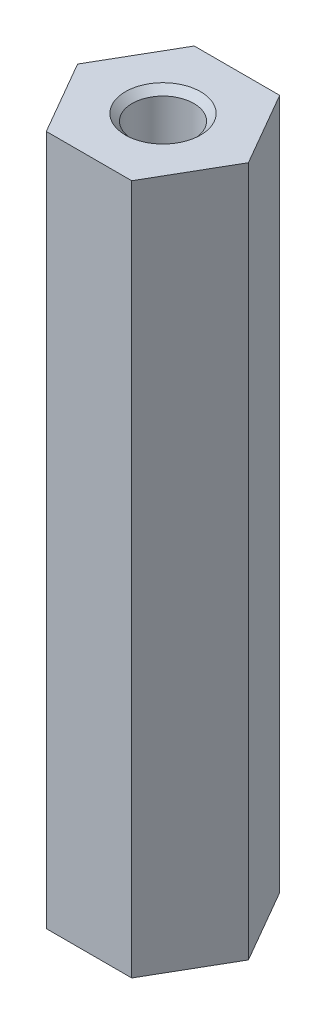
ISO-10303-21;
HEADER;
FILE_DESCRIPTION(('STEP AP214'),'2;1');
FILE_NAME('part.step','',(''),(''),'','','');
FILE_SCHEMA(('AUTOMOTIVE_DESIGN { 1 0 10303 214 1 1 1 1 }'));
ENDSEC;
DATA;
#1=APPLICATION_CONTEXT('core data for automotive mechanical design processes');
#2=APPLICATION_PROTOCOL_DEFINITION('international standard','automotive_design',2000,#1);
#3=PRODUCT_CONTEXT('',#1,'mechanical');
#4=PRODUCT('Part','Part','',(#3));
#5=PRODUCT_RELATED_PRODUCT_CATEGORY('part','',(#4));
#6=PRODUCT_DEFINITION_FORMATION('','',#4);
#7=PRODUCT_DEFINITION_CONTEXT('part definition',#1,'design');
#8=PRODUCT_DEFINITION('design','',#6,#7);
#9=PRODUCT_DEFINITION_SHAPE('','',#8);
#10=(LENGTH_UNIT() NAMED_UNIT(*) SI_UNIT(.MILLI.,.METRE.));
#11=(NAMED_UNIT(*) PLANE_ANGLE_UNIT() SI_UNIT($,.RADIAN.));
#12=(NAMED_UNIT(*) SI_UNIT($,.STERADIAN.) SOLID_ANGLE_UNIT());
#13=UNCERTAINTY_MEASURE_WITH_UNIT(LENGTH_MEASURE(1.E-05),#10,'distance_accuracy_value','');
#14=(GEOMETRIC_REPRESENTATION_CONTEXT(3) GLOBAL_UNCERTAINTY_ASSIGNED_CONTEXT((#13)) GLOBAL_UNIT_ASSIGNED_CONTEXT((#10,
#11,#12)) REPRESENTATION_CONTEXT('',''));
#15=CARTESIAN_POINT('',(0.,0.,0.));
#16=DIRECTION('',(0.,0.,1.));
#17=DIRECTION('',(1.,0.,0.));
#18=AXIS2_PLACEMENT_3D('',#15,#16,#17);
#19=CARTESIAN_POINT('',(1.73205080756888,28.,3.));
#20=DIRECTION('',(-0.866025403784439,0.,-0.5));
#21=DIRECTION('',(-0.5,0.,0.866025403784439));
#22=AXIS2_PLACEMENT_3D('',#19,#20,#21);
#23=PLANE('',#22);
#24=DIRECTION('',(0.5,0.,-0.866025403784439));
#25=VECTOR('',#24,1.);
#26=CARTESIAN_POINT('',(1.73205080756888,0.,3.));
#27=LINE('',#26,#25);
#28=CARTESIAN_POINT('',(1.73205080756888,0.,3.));
#29=VERTEX_POINT('',#28);
#30=CARTESIAN_POINT('',(3.46410161513775,0.,0.));
#31=VERTEX_POINT('',#30);
#32=EDGE_CURVE('E125',#29,#31,#27,.T.);
#33=ORIENTED_EDGE('',*,*,#32,.T.);
#34=DIRECTION('',(0.,-1.,0.));
#35=VECTOR('',#34,1.);
#36=CARTESIAN_POINT('',(3.46410161513775,28.,0.));
#37=LINE('',#36,#35);
#38=CARTESIAN_POINT('',(3.46410161513775,28.,0.));
#39=VERTEX_POINT('',#38);
#40=EDGE_CURVE('E11',#39,#31,#37,.T.);
#41=ORIENTED_EDGE('',*,*,#40,.F.);
#42=DIRECTION('',(0.5,0.,-0.866025403784439));
#43=VECTOR('',#42,1.);
#44=CARTESIAN_POINT('',(1.73205080756888,28.,3.));
#45=LINE('',#44,#43);
#46=CARTESIAN_POINT('',(1.73205080756888,28.,3.));
#47=VERTEX_POINT('',#46);
#48=EDGE_CURVE('E136',#47,#39,#45,.T.);
#49=ORIENTED_EDGE('',*,*,#48,.F.);
#50=DIRECTION('',(0.,-1.,0.));
#51=VECTOR('',#50,1.);
#52=CARTESIAN_POINT('',(1.73205080756888,28.,3.));
#53=LINE('',#52,#51);
#54=EDGE_CURVE('E121',#47,#29,#53,.T.);
#55=ORIENTED_EDGE('',*,*,#54,.T.);
#56=EDGE_LOOP('',(#33,#41,#49,#55));
#57=FACE_BOUND('',#56,.T.);
#58=ADVANCED_FACE('F41',(#57),#23,.F.);
#59=CARTESIAN_POINT('',(3.46410161513775,28.,0.));
#60=DIRECTION('',(-0.866025403784439,0.,0.5));
#61=DIRECTION('',(0.5,0.,0.866025403784439));
#62=AXIS2_PLACEMENT_3D('',#59,#60,#61);
#63=PLANE('',#62);
#64=DIRECTION('',(-0.5,0.,-0.866025403784439));
#65=VECTOR('',#64,1.);
#66=CARTESIAN_POINT('',(3.46410161513775,0.,0.));
#67=LINE('',#66,#65);
#68=CARTESIAN_POINT('',(1.73205080756888,0.,-3.));
#69=VERTEX_POINT('',#68);
#70=EDGE_CURVE('E128',#31,#69,#67,.T.);
#71=ORIENTED_EDGE('',*,*,#70,.T.);
#72=DIRECTION('',(0.,-1.,0.));
#73=VECTOR('',#72,1.);
#74=CARTESIAN_POINT('',(1.73205080756888,28.,-3.));
#75=LINE('',#74,#73);
#76=CARTESIAN_POINT('',(1.73205080756888,28.,-3.));
#77=VERTEX_POINT('',#76);
#78=EDGE_CURVE('E49',#77,#69,#75,.T.);
#79=ORIENTED_EDGE('',*,*,#78,.F.);
#80=DIRECTION('',(-0.5,0.,-0.866025403784439));
#81=VECTOR('',#80,1.);
#82=CARTESIAN_POINT('',(3.46410161513775,28.,0.));
#83=LINE('',#82,#81);
#84=EDGE_CURVE('E94',#39,#77,#83,.T.);
#85=ORIENTED_EDGE('',*,*,#84,.F.);
#86=ORIENTED_EDGE('',*,*,#40,.T.);
#87=EDGE_LOOP('',(#71,#79,#85,#86));
#88=FACE_BOUND('',#87,.T.);
#89=ADVANCED_FACE('F161',(#88),#63,.F.);
#90=CARTESIAN_POINT('',(1.73205080756888,28.,-3.));
#91=DIRECTION('',(0.,0.,1.));
#92=DIRECTION('',(1.,0.,0.));
#93=AXIS2_PLACEMENT_3D('',#90,#91,#92);
#94=PLANE('',#93);
#95=DIRECTION('',(-1.,0.,0.));
#96=VECTOR('',#95,1.);
#97=CARTESIAN_POINT('',(1.73205080756888,0.,-3.));
#98=LINE('',#97,#96);
#99=CARTESIAN_POINT('',(-1.73205080756888,0.,-3.));
#100=VERTEX_POINT('',#99);
#101=EDGE_CURVE('E131',#69,#100,#98,.T.);
#102=ORIENTED_EDGE('',*,*,#101,.T.);
#103=DIRECTION('',(0.,-1.,0.));
#104=VECTOR('',#103,1.);
#105=CARTESIAN_POINT('',(-1.73205080756888,28.,-3.));
#106=LINE('',#105,#104);
#107=CARTESIAN_POINT('',(-1.73205080756888,28.,-3.));
#108=VERTEX_POINT('',#107);
#109=EDGE_CURVE('E116',#108,#100,#106,.T.);
#110=ORIENTED_EDGE('',*,*,#109,.F.);
#111=DIRECTION('',(-1.,0.,0.));
#112=VECTOR('',#111,1.);
#113=CARTESIAN_POINT('',(1.73205080756888,28.,-3.));
#114=LINE('',#113,#112);
#115=EDGE_CURVE('E107',#77,#108,#114,.T.);
#116=ORIENTED_EDGE('',*,*,#115,.F.);
#117=ORIENTED_EDGE('',*,*,#78,.T.);
#118=EDGE_LOOP('',(#102,#110,#116,#117));
#119=FACE_BOUND('',#118,.T.);
#120=ADVANCED_FACE('F142',(#119),#94,.F.);
#121=CARTESIAN_POINT('',(-1.73205080756888,28.,-3.));
#122=DIRECTION('',(0.866025403784439,0.,0.5));
#123=DIRECTION('',(0.5,0.,-0.866025403784439));
#124=AXIS2_PLACEMENT_3D('',#121,#122,#123);
#125=PLANE('',#124);
#126=DIRECTION('',(-0.5,0.,0.866025403784439));
#127=VECTOR('',#126,1.);
#128=CARTESIAN_POINT('',(-1.73205080756888,0.,-3.));
#129=LINE('',#128,#127);
#130=CARTESIAN_POINT('',(-3.46410161513776,0.,0.));
#131=VERTEX_POINT('',#130);
#132=EDGE_CURVE('E115',#100,#131,#129,.T.);
#133=ORIENTED_EDGE('',*,*,#132,.T.);
#134=DIRECTION('',(0.,-1.,0.));
#135=VECTOR('',#134,1.);
#136=CARTESIAN_POINT('',(-3.46410161513776,28.,0.));
#137=LINE('',#136,#135);
#138=CARTESIAN_POINT('',(-3.46410161513776,28.,0.));
#139=VERTEX_POINT('',#138);
#140=EDGE_CURVE('E112',#139,#131,#137,.T.);
#141=ORIENTED_EDGE('',*,*,#140,.F.);
#142=DIRECTION('',(-0.5,0.,0.866025403784439));
#143=VECTOR('',#142,1.);
#144=CARTESIAN_POINT('',(-1.73205080756888,28.,-3.));
#145=LINE('',#144,#143);
#146=EDGE_CURVE('E101',#108,#139,#145,.T.);
#147=ORIENTED_EDGE('',*,*,#146,.F.);
#148=ORIENTED_EDGE('',*,*,#109,.T.);
#149=EDGE_LOOP('',(#133,#141,#147,#148));
#150=FACE_BOUND('',#149,.T.);
#151=ADVANCED_FACE('F113',(#150),#125,.F.);
#152=CARTESIAN_POINT('',(-3.46410161513776,28.,0.));
#153=DIRECTION('',(0.866025403784439,0.,-0.5));
#154=DIRECTION('',(-0.5,0.,-0.866025403784439));
#155=AXIS2_PLACEMENT_3D('',#152,#153,#154);
#156=PLANE('',#155);
#157=DIRECTION('',(0.5,0.,0.866025403784439));
#158=VECTOR('',#157,1.);
#159=CARTESIAN_POINT('',(-3.46410161513776,0.,0.));
#160=LINE('',#159,#158);
#161=CARTESIAN_POINT('',(-1.73205080756888,0.,3.));
#162=VERTEX_POINT('',#161);
#163=EDGE_CURVE('E80',#131,#162,#160,.T.);
#164=ORIENTED_EDGE('',*,*,#163,.T.);
#165=DIRECTION('',(0.,-1.,0.));
#166=VECTOR('',#165,1.);
#167=CARTESIAN_POINT('',(-1.73205080756888,28.,3.));
#168=LINE('',#167,#166);
#169=CARTESIAN_POINT('',(-1.73205080756888,28.,3.));
#170=VERTEX_POINT('',#169);
#171=EDGE_CURVE('E117',#170,#162,#168,.T.);
#172=ORIENTED_EDGE('',*,*,#171,.F.);
#173=DIRECTION('',(0.5,0.,0.866025403784439));
#174=VECTOR('',#173,1.);
#175=CARTESIAN_POINT('',(-3.46410161513776,28.,0.));
#176=LINE('',#175,#174);
#177=EDGE_CURVE('E105',#139,#170,#176,.T.);
#178=ORIENTED_EDGE('',*,*,#177,.F.);
#179=ORIENTED_EDGE('',*,*,#140,.T.);
#180=EDGE_LOOP('',(#164,#172,#178,#179));
#181=FACE_BOUND('',#180,.T.);
#182=ADVANCED_FACE('F119',(#181),#156,.F.);
#183=CARTESIAN_POINT('',(-1.73205080756888,28.,3.));
#184=DIRECTION('',(0.,0.,-1.));
#185=DIRECTION('',(-1.,0.,0.));
#186=AXIS2_PLACEMENT_3D('',#183,#184,#185);
#187=PLANE('',#186);
#188=DIRECTION('',(1.,0.,0.));
#189=VECTOR('',#188,1.);
#190=CARTESIAN_POINT('',(-1.73205080756888,0.,3.));
#191=LINE('',#190,#189);
#192=EDGE_CURVE('E86',#162,#29,#191,.T.);
#193=ORIENTED_EDGE('',*,*,#192,.T.);
#194=ORIENTED_EDGE('',*,*,#54,.F.);
#195=DIRECTION('',(1.,0.,0.));
#196=VECTOR('',#195,1.);
#197=CARTESIAN_POINT('',(-1.73205080756888,28.,3.));
#198=LINE('',#197,#196);
#199=EDGE_CURVE('E57',#170,#47,#198,.T.);
#200=ORIENTED_EDGE('',*,*,#199,.F.);
#201=ORIENTED_EDGE('',*,*,#171,.T.);
#202=EDGE_LOOP('',(#193,#194,#200,#201));
#203=FACE_BOUND('',#202,.T.);
#204=ADVANCED_FACE('F149',(#203),#187,.F.);
#205=CARTESIAN_POINT('',(0.,28.,0.));
#206=DIRECTION('',(0.,1.,0.));
#207=DIRECTION('',(0.,0.,1.));
#208=AXIS2_PLACEMENT_3D('',#205,#206,#207);
#209=PLANE('',#208);
#210=CARTESIAN_POINT('',(0.,28.,0.));
#211=DIRECTION('',(0.,1.,0.));
#212=DIRECTION('',(0.,0.,1.));
#213=AXIS2_PLACEMENT_3D('',#210,#211,#212);
#214=CIRCLE('',#213,1.525);
#215=CARTESIAN_POINT('',(0.,28.,1.525));
#216=VERTEX_POINT('',#215);
#217=EDGE_CURVE('E267',#216,#216,#214,.T.);
#218=ORIENTED_EDGE('',*,*,#217,.F.);
#219=EDGE_LOOP('',(#218));
#220=FACE_BOUND('',#219,.T.);
#221=ORIENTED_EDGE('',*,*,#48,.T.);
#222=ORIENTED_EDGE('',*,*,#84,.T.);
#223=ORIENTED_EDGE('',*,*,#115,.T.);
#224=ORIENTED_EDGE('',*,*,#146,.T.);
#225=ORIENTED_EDGE('',*,*,#177,.T.);
#226=ORIENTED_EDGE('',*,*,#199,.T.);
#227=EDGE_LOOP('',(#221,#222,#223,#224,#225,#226));
#228=FACE_BOUND('',#227,.T.);
#229=ADVANCED_FACE('F103',(#220,#228),#209,.T.);
#230=CARTESIAN_POINT('',(0.,0.,0.));
#231=DIRECTION('',(0.,1.,0.));
#232=DIRECTION('',(0.,0.,1.));
#233=AXIS2_PLACEMENT_3D('',#230,#231,#232);
#234=PLANE('',#233);
#235=CARTESIAN_POINT('',(0.,0.,0.));
#236=DIRECTION('',(0.,1.,0.));
#237=DIRECTION('',(0.,0.,1.));
#238=AXIS2_PLACEMENT_3D('',#235,#236,#237);
#239=CIRCLE('',#238,1.24999999999999);
#240=CARTESIAN_POINT('',(0.,0.,1.24999999999999));
#241=VERTEX_POINT('',#240);
#242=EDGE_CURVE('E129',#241,#241,#239,.T.);
#243=ORIENTED_EDGE('',*,*,#242,.T.);
#244=EDGE_LOOP('',(#243));
#245=FACE_BOUND('',#244,.T.);
#246=ORIENTED_EDGE('',*,*,#32,.F.);
#247=ORIENTED_EDGE('',*,*,#192,.F.);
#248=ORIENTED_EDGE('',*,*,#163,.F.);
#249=ORIENTED_EDGE('',*,*,#132,.F.);
#250=ORIENTED_EDGE('',*,*,#101,.F.);
#251=ORIENTED_EDGE('',*,*,#70,.F.);
#252=EDGE_LOOP('',(#246,#247,#248,#249,#250,#251));
#253=FACE_BOUND('',#252,.T.);
#254=ADVANCED_FACE('F145',(#245,#253),#234,.F.);
#255=CARTESIAN_POINT('',(0.,28.,0.));
#256=DIRECTION('',(0.,1.,0.));
#257=DIRECTION('',(0.,0.,1.));
#258=AXIS2_PLACEMENT_3D('',#255,#256,#257);
#259=CYLINDRICAL_SURFACE('',#258,1.25);
#260=ORIENTED_EDGE('',*,*,#242,.F.);
#261=EDGE_LOOP('',(#260));
#262=FACE_BOUND('',#261,.T.);
#263=CARTESIAN_POINT('',(0.,27.725,0.));
#264=DIRECTION('',(0.,1.,0.));
#265=DIRECTION('',(0.,0.,1.));
#266=AXIS2_PLACEMENT_3D('',#263,#264,#265);
#267=CIRCLE('',#266,1.25);
#268=CARTESIAN_POINT('',(0.,27.725,1.25));
#269=VERTEX_POINT('',#268);
#270=EDGE_CURVE('E264',#269,#269,#267,.T.);
#271=ORIENTED_EDGE('',*,*,#270,.T.);
#272=EDGE_LOOP('',(#271));
#273=FACE_BOUND('',#272,.T.);
#274=ADVANCED_FACE('F201',(#262,#273),#259,.F.);
#275=CARTESIAN_POINT('',(0.,28.,0.));
#276=DIRECTION('',(0.,1.,0.));
#277=DIRECTION('',(0.,0.,1.));
#278=AXIS2_PLACEMENT_3D('',#275,#276,#277);
#279=CONICAL_SURFACE('',#278,1.525,0.785398163397443);
#280=ORIENTED_EDGE('',*,*,#270,.F.);
#281=EDGE_LOOP('',(#280));
#282=FACE_BOUND('',#281,.T.);
#283=ORIENTED_EDGE('',*,*,#217,.T.);
#284=EDGE_LOOP('',(#283));
#285=FACE_BOUND('',#284,.T.);
#286=ADVANCED_FACE('F212',(#282,#285),#279,.F.);
#287=CLOSED_SHELL('',(#58,#89,#120,#151,#182,#204,#229,#254,#274,#286));
#288=MANIFOLD_SOLID_BREP('B2',#287);
#289=ADVANCED_BREP_SHAPE_REPRESENTATION('',(#18,#288),#14);
#290=SHAPE_DEFINITION_REPRESENTATION(#9,#289);
ENDSEC;
END-ISO-10303-21;
